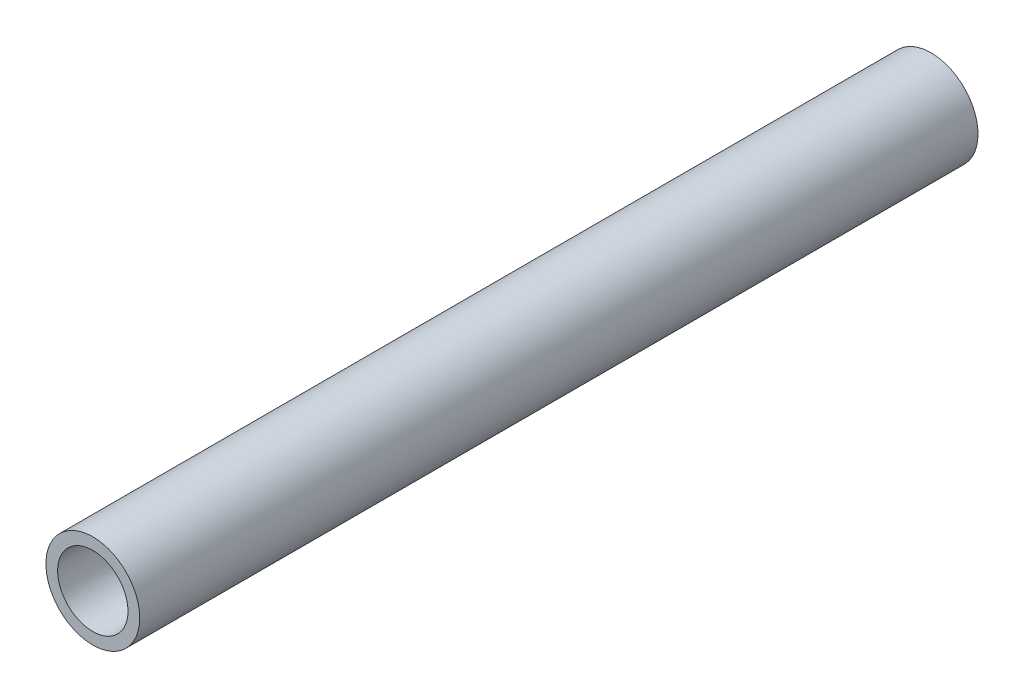
ISO-10303-21;
HEADER;
FILE_DESCRIPTION(('STEP AP214'),'2;1');
FILE_NAME('part.step','',(''),(''),'','','');
FILE_SCHEMA(('AUTOMOTIVE_DESIGN { 1 0 10303 214 1 1 1 1 }'));
ENDSEC;
DATA;
#1=APPLICATION_CONTEXT('core data for automotive mechanical design processes');
#2=APPLICATION_PROTOCOL_DEFINITION('international standard','automotive_design',2000,#1);
#3=PRODUCT_CONTEXT('',#1,'mechanical');
#4=PRODUCT('Part','Part','',(#3));
#5=PRODUCT_RELATED_PRODUCT_CATEGORY('part','',(#4));
#6=PRODUCT_DEFINITION_FORMATION('','',#4);
#7=PRODUCT_DEFINITION_CONTEXT('part definition',#1,'design');
#8=PRODUCT_DEFINITION('design','',#6,#7);
#9=PRODUCT_DEFINITION_SHAPE('','',#8);
#10=(LENGTH_UNIT() NAMED_UNIT(*) SI_UNIT(.MILLI.,.METRE.));
#11=(NAMED_UNIT(*) PLANE_ANGLE_UNIT() SI_UNIT($,.RADIAN.));
#12=(NAMED_UNIT(*) SI_UNIT($,.STERADIAN.) SOLID_ANGLE_UNIT());
#13=UNCERTAINTY_MEASURE_WITH_UNIT(LENGTH_MEASURE(1.E-05),#10,'distance_accuracy_value','');
#14=(GEOMETRIC_REPRESENTATION_CONTEXT(3) GLOBAL_UNCERTAINTY_ASSIGNED_CONTEXT((#13)) GLOBAL_UNIT_ASSIGNED_CONTEXT((#10,
#11,#12)) REPRESENTATION_CONTEXT('',''));
#15=CARTESIAN_POINT('',(0.,0.,0.));
#16=DIRECTION('',(0.,0.,1.));
#17=DIRECTION('',(1.,0.,0.));
#18=AXIS2_PLACEMENT_3D('',#15,#16,#17);
#19=CARTESIAN_POINT('',(0.,0.,71.5));
#20=DIRECTION('',(0.,0.,1.));
#21=DIRECTION('',(1.,0.,0.));
#22=AXIS2_PLACEMENT_3D('',#19,#20,#21);
#23=PLANE('',#22);
#24=CARTESIAN_POINT('',(0.,0.,71.5));
#25=DIRECTION('',(0.,0.,1.));
#26=DIRECTION('',(1.,0.,0.));
#27=AXIS2_PLACEMENT_3D('',#24,#25,#26);
#28=CIRCLE('',#27,4.);
#29=CARTESIAN_POINT('',(4.,0.,71.5));
#30=VERTEX_POINT('',#29);
#31=EDGE_CURVE('E11',#30,#30,#28,.T.);
#32=ORIENTED_EDGE('',*,*,#31,.T.);
#33=EDGE_LOOP('',(#32));
#34=FACE_BOUND('',#33,.T.);
#35=CARTESIAN_POINT('',(0.,0.,71.5));
#36=DIRECTION('',(0.,0.,1.));
#37=DIRECTION('',(1.,0.,0.));
#38=AXIS2_PLACEMENT_3D('',#35,#36,#37);
#39=CIRCLE('',#38,3.);
#40=CARTESIAN_POINT('',(3.,0.,71.5));
#41=VERTEX_POINT('',#40);
#42=EDGE_CURVE('E65',#41,#41,#39,.T.);
#43=ORIENTED_EDGE('',*,*,#42,.F.);
#44=EDGE_LOOP('',(#43));
#45=FACE_BOUND('',#44,.T.);
#46=ADVANCED_FACE('F51',(#34,#45),#23,.T.);
#47=CARTESIAN_POINT('',(0.,0.,0.));
#48=DIRECTION('',(0.,0.,1.));
#49=DIRECTION('',(1.,0.,0.));
#50=AXIS2_PLACEMENT_3D('',#47,#48,#49);
#51=PLANE('',#50);
#52=CARTESIAN_POINT('',(0.,0.,0.));
#53=DIRECTION('',(0.,0.,1.));
#54=DIRECTION('',(1.,0.,0.));
#55=AXIS2_PLACEMENT_3D('',#52,#53,#54);
#56=CIRCLE('',#55,4.);
#57=CARTESIAN_POINT('',(4.,0.,0.));
#58=VERTEX_POINT('',#57);
#59=EDGE_CURVE('E54',#58,#58,#56,.T.);
#60=ORIENTED_EDGE('',*,*,#59,.F.);
#61=EDGE_LOOP('',(#60));
#62=FACE_BOUND('',#61,.T.);
#63=CARTESIAN_POINT('',(0.,0.,0.));
#64=DIRECTION('',(0.,0.,1.));
#65=DIRECTION('',(1.,0.,0.));
#66=AXIS2_PLACEMENT_3D('',#63,#64,#65);
#67=CIRCLE('',#66,3.);
#68=CARTESIAN_POINT('',(3.,0.,0.));
#69=VERTEX_POINT('',#68);
#70=EDGE_CURVE('E68',#69,#69,#67,.T.);
#71=ORIENTED_EDGE('',*,*,#70,.T.);
#72=EDGE_LOOP('',(#71));
#73=FACE_BOUND('',#72,.T.);
#74=ADVANCED_FACE('F77',(#62,#73),#51,.F.);
#75=CARTESIAN_POINT('',(0.,0.,71.5));
#76=DIRECTION('',(0.,0.,-1.));
#77=DIRECTION('',(-1.,0.,0.));
#78=AXIS2_PLACEMENT_3D('',#75,#76,#77);
#79=CYLINDRICAL_SURFACE('',#78,4.);
#80=ORIENTED_EDGE('',*,*,#31,.F.);
#81=EDGE_LOOP('',(#80));
#82=FACE_BOUND('',#81,.T.);
#83=ORIENTED_EDGE('',*,*,#59,.T.);
#84=EDGE_LOOP('',(#83));
#85=FACE_BOUND('',#84,.T.);
#86=ADVANCED_FACE('F52',(#82,#85),#79,.T.);
#87=CARTESIAN_POINT('',(0.,0.,71.5));
#88=DIRECTION('',(0.,0.,-1.));
#89=DIRECTION('',(-1.,0.,0.));
#90=AXIS2_PLACEMENT_3D('',#87,#88,#89);
#91=CYLINDRICAL_SURFACE('',#90,3.);
#92=ORIENTED_EDGE('',*,*,#42,.T.);
#93=EDGE_LOOP('',(#92));
#94=FACE_BOUND('',#93,.T.);
#95=ORIENTED_EDGE('',*,*,#70,.F.);
#96=EDGE_LOOP('',(#95));
#97=FACE_BOUND('',#96,.T.);
#98=ADVANCED_FACE('F74',(#94,#97),#91,.F.);
#99=CLOSED_SHELL('',(#46,#74,#86,#98));
#100=MANIFOLD_SOLID_BREP('B2',#99);
#101=ADVANCED_BREP_SHAPE_REPRESENTATION('',(#18,#100),#14);
#102=SHAPE_DEFINITION_REPRESENTATION(#9,#101);
ENDSEC;
END-ISO-10303-21;
